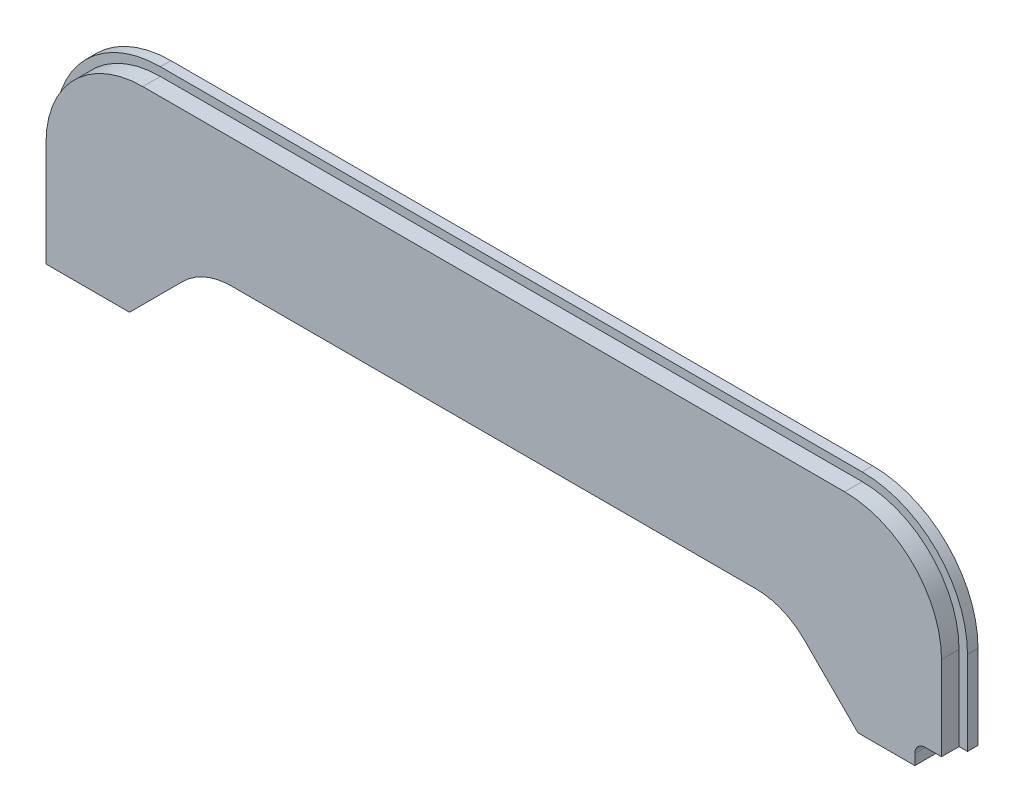
ISO-10303-21;
HEADER;
FILE_DESCRIPTION(('STEP AP214'),'2;1');
FILE_NAME('part.step','',(''),(''),'','','');
FILE_SCHEMA(('AUTOMOTIVE_DESIGN { 1 0 10303 214 1 1 1 1 }'));
ENDSEC;
DATA;
#1=APPLICATION_CONTEXT('core data for automotive mechanical design processes');
#2=APPLICATION_PROTOCOL_DEFINITION('international standard','automotive_design',2000,#1);
#3=PRODUCT_CONTEXT('',#1,'mechanical');
#4=PRODUCT('Part','Part','',(#3));
#5=PRODUCT_RELATED_PRODUCT_CATEGORY('part','',(#4));
#6=PRODUCT_DEFINITION_FORMATION('','',#4);
#7=PRODUCT_DEFINITION_CONTEXT('part definition',#1,'design');
#8=PRODUCT_DEFINITION('design','',#6,#7);
#9=PRODUCT_DEFINITION_SHAPE('','',#8);
#10=(LENGTH_UNIT() NAMED_UNIT(*) SI_UNIT(.MILLI.,.METRE.));
#11=(NAMED_UNIT(*) PLANE_ANGLE_UNIT() SI_UNIT($,.RADIAN.));
#12=(NAMED_UNIT(*) SI_UNIT($,.STERADIAN.) SOLID_ANGLE_UNIT());
#13=UNCERTAINTY_MEASURE_WITH_UNIT(LENGTH_MEASURE(1.E-05),#10,'distance_accuracy_value','');
#14=(GEOMETRIC_REPRESENTATION_CONTEXT(3) GLOBAL_UNCERTAINTY_ASSIGNED_CONTEXT((#13)) GLOBAL_UNIT_ASSIGNED_CONTEXT((#10,
#11,#12)) REPRESENTATION_CONTEXT('',''));
#15=CARTESIAN_POINT('',(0.,0.,0.));
#16=DIRECTION('',(0.,0.,1.));
#17=DIRECTION('',(1.,0.,0.));
#18=AXIS2_PLACEMENT_3D('',#15,#16,#17);
#19=CARTESIAN_POINT('',(-16.51,0.,1.016));
#20=DIRECTION('',(0.,1.,0.));
#21=DIRECTION('',(0.,0.,1.));
#22=AXIS2_PLACEMENT_3D('',#19,#20,#21);
#23=PLANE('',#22);
#24=DIRECTION('',(1.,0.,0.));
#25=VECTOR('',#24,1.);
#26=CARTESIAN_POINT('',(-16.51,0.,0.));
#27=LINE('',#26,#25);
#28=CARTESIAN_POINT('',(-16.51,0.,0.));
#29=VERTEX_POINT('',#28);
#30=CARTESIAN_POINT('',(-13.1826,0.,0.));
#31=VERTEX_POINT('',#30);
#32=EDGE_CURVE('E223',#29,#31,#27,.T.);
#33=ORIENTED_EDGE('',*,*,#32,.T.);
#34=DIRECTION('',(0.,0.,1.));
#35=VECTOR('',#34,1.);
#36=CARTESIAN_POINT('',(-13.1826,0.,0.));
#37=LINE('',#36,#35);
#38=CARTESIAN_POINT('',(-13.1826,0.,1.016));
#39=VERTEX_POINT('',#38);
#40=EDGE_CURVE('E275',#31,#39,#37,.T.);
#41=ORIENTED_EDGE('',*,*,#40,.T.);
#42=DIRECTION('',(1.,0.,0.));
#43=VECTOR('',#42,1.);
#44=CARTESIAN_POINT('',(-16.51,0.,1.016));
#45=LINE('',#44,#43);
#46=CARTESIAN_POINT('',(-16.2052,0.,1.016));
#47=VERTEX_POINT('',#46);
#48=EDGE_CURVE('E211',#47,#39,#45,.T.);
#49=ORIENTED_EDGE('',*,*,#48,.F.);
#50=DIRECTION('',(0.,0.,1.));
#51=VECTOR('',#50,1.);
#52=CARTESIAN_POINT('',(-16.2052,0.,0.381));
#53=LINE('',#52,#51);
#54=CARTESIAN_POINT('',(-16.2052,0.,0.381));
#55=VERTEX_POINT('',#54);
#56=EDGE_CURVE('E270',#55,#47,#53,.T.);
#57=ORIENTED_EDGE('',*,*,#56,.F.);
#58=DIRECTION('',(1.,0.,0.));
#59=VECTOR('',#58,1.);
#60=CARTESIAN_POINT('',(-16.51,0.,0.381));
#61=LINE('',#60,#59);
#62=CARTESIAN_POINT('',(-16.51,0.,0.381));
#63=VERTEX_POINT('',#62);
#64=EDGE_CURVE('E252',#63,#55,#61,.T.);
#65=ORIENTED_EDGE('',*,*,#64,.F.);
#66=DIRECTION('',(0.,0.,-1.));
#67=VECTOR('',#66,1.);
#68=CARTESIAN_POINT('',(-16.51,0.,1.016));
#69=LINE('',#68,#67);
#70=EDGE_CURVE('E227',#63,#29,#69,.T.);
#71=ORIENTED_EDGE('',*,*,#70,.T.);
#72=EDGE_LOOP('',(#33,#41,#49,#57,#65,#71));
#73=FACE_BOUND('',#72,.T.);
#74=ADVANCED_FACE('F40',(#73),#23,.F.);
#75=CARTESIAN_POINT('',(16.51,3.80999999999997,1.016));
#76=DIRECTION('',(-1.,0.,0.));
#77=DIRECTION('',(0.,0.,1.));
#78=AXIS2_PLACEMENT_3D('',#75,#76,#77);
#79=PLANE('',#78);
#80=DIRECTION('',(0.,1.,0.));
#81=VECTOR('',#80,1.);
#82=CARTESIAN_POINT('',(16.51,0.,0.381));
#83=LINE('',#82,#81);
#84=CARTESIAN_POINT('',(16.51,0.762,0.381));
#85=VERTEX_POINT('',#84);
#86=CARTESIAN_POINT('',(16.51,3.80999999999997,0.381));
#87=VERTEX_POINT('',#86);
#88=EDGE_CURVE('E196',#85,#87,#83,.T.);
#89=ORIENTED_EDGE('',*,*,#88,.F.);
#90=DIRECTION('',(0.,0.,1.));
#91=VECTOR('',#90,1.);
#92=CARTESIAN_POINT('',(16.51,0.762,0.));
#93=LINE('',#92,#91);
#94=CARTESIAN_POINT('',(16.51,0.762,0.));
#95=VERTEX_POINT('',#94);
#96=EDGE_CURVE('E54',#95,#85,#93,.T.);
#97=ORIENTED_EDGE('',*,*,#96,.F.);
#98=DIRECTION('',(0.,1.,0.));
#99=VECTOR('',#98,1.);
#100=CARTESIAN_POINT('',(16.51,3.80999999999997,0.));
#101=LINE('',#100,#99);
#102=CARTESIAN_POINT('',(16.51,3.80999999999997,0.));
#103=VERTEX_POINT('',#102);
#104=EDGE_CURVE('E194',#95,#103,#101,.T.);
#105=ORIENTED_EDGE('',*,*,#104,.T.);
#106=DIRECTION('',(0.,0.,-1.));
#107=VECTOR('',#106,1.);
#108=CARTESIAN_POINT('',(16.51,3.80999999999997,1.016));
#109=LINE('',#108,#107);
#110=EDGE_CURVE('E48',#87,#103,#109,.T.);
#111=ORIENTED_EDGE('',*,*,#110,.F.);
#112=EDGE_LOOP('',(#89,#97,#105,#111));
#113=FACE_BOUND('',#112,.T.);
#114=ADVANCED_FACE('F42',(#113),#79,.F.);
#115=CARTESIAN_POINT('',(12.7,3.81,1.016));
#116=DIRECTION('',(0.,0.,-1.));
#117=DIRECTION('',(-1.,0.,0.));
#118=AXIS2_PLACEMENT_3D('',#115,#116,#117);
#119=CYLINDRICAL_SURFACE('',#118,3.81);
#120=CARTESIAN_POINT('',(12.7,3.81,0.381));
#121=DIRECTION('',(0.,0.,1.));
#122=DIRECTION('',(1.,0.,0.));
#123=AXIS2_PLACEMENT_3D('',#120,#121,#122);
#124=CIRCLE('',#123,3.81);
#125=CARTESIAN_POINT('',(12.7,7.62,0.381));
#126=VERTEX_POINT('',#125);
#127=EDGE_CURVE('E238',#87,#126,#124,.T.);
#128=ORIENTED_EDGE('',*,*,#127,.F.);
#129=ORIENTED_EDGE('',*,*,#110,.T.);
#130=CARTESIAN_POINT('',(12.7,3.81,0.));
#131=DIRECTION('',(0.,0.,1.));
#132=DIRECTION('',(-1.,0.,0.));
#133=AXIS2_PLACEMENT_3D('',#130,#131,#132);
#134=CIRCLE('',#133,3.81);
#135=CARTESIAN_POINT('',(12.7,7.62,0.));
#136=VERTEX_POINT('',#135);
#137=EDGE_CURVE('E203',#103,#136,#134,.T.);
#138=ORIENTED_EDGE('',*,*,#137,.T.);
#139=DIRECTION('',(0.,0.,-1.));
#140=VECTOR('',#139,1.);
#141=CARTESIAN_POINT('',(12.7,7.62,1.016));
#142=LINE('',#141,#140);
#143=EDGE_CURVE('E233',#126,#136,#142,.T.);
#144=ORIENTED_EDGE('',*,*,#143,.F.);
#145=EDGE_LOOP('',(#128,#129,#138,#144));
#146=FACE_BOUND('',#145,.T.);
#147=ADVANCED_FACE('F236',(#146),#119,.T.);
#148=CARTESIAN_POINT('',(-12.7,7.62,1.016));
#149=DIRECTION('',(0.,-1.,0.));
#150=DIRECTION('',(0.,0.,-1.));
#151=AXIS2_PLACEMENT_3D('',#148,#149,#150);
#152=PLANE('',#151);
#153=DIRECTION('',(-1.,0.,0.));
#154=VECTOR('',#153,1.);
#155=CARTESIAN_POINT('',(12.7,7.62,0.381));
#156=LINE('',#155,#154);
#157=CARTESIAN_POINT('',(-12.7,7.62,0.381));
#158=VERTEX_POINT('',#157);
#159=EDGE_CURVE('E241',#126,#158,#156,.T.);
#160=ORIENTED_EDGE('',*,*,#159,.F.);
#161=ORIENTED_EDGE('',*,*,#143,.T.);
#162=DIRECTION('',(-1.,0.,0.));
#163=VECTOR('',#162,1.);
#164=CARTESIAN_POINT('',(-12.7,7.62,0.));
#165=LINE('',#164,#163);
#166=CARTESIAN_POINT('',(-12.7,7.62,0.));
#167=VERTEX_POINT('',#166);
#168=EDGE_CURVE('E206',#136,#167,#165,.T.);
#169=ORIENTED_EDGE('',*,*,#168,.T.);
#170=DIRECTION('',(0.,0.,-1.));
#171=VECTOR('',#170,1.);
#172=CARTESIAN_POINT('',(-12.7,7.62,1.016));
#173=LINE('',#172,#171);
#174=EDGE_CURVE('E231',#158,#167,#173,.T.);
#175=ORIENTED_EDGE('',*,*,#174,.F.);
#176=EDGE_LOOP('',(#160,#161,#169,#175));
#177=FACE_BOUND('',#176,.T.);
#178=ADVANCED_FACE('F438',(#177),#152,.F.);
#179=CARTESIAN_POINT('',(-12.7,3.81,1.016));
#180=DIRECTION('',(0.,0.,-1.));
#181=DIRECTION('',(-1.,0.,0.));
#182=AXIS2_PLACEMENT_3D('',#179,#180,#181);
#183=CYLINDRICAL_SURFACE('',#182,3.81);
#184=CARTESIAN_POINT('',(-12.7,3.81,0.381));
#185=DIRECTION('',(0.,0.,1.));
#186=DIRECTION('',(1.,0.,0.));
#187=AXIS2_PLACEMENT_3D('',#184,#185,#186);
#188=CIRCLE('',#187,3.81);
#189=CARTESIAN_POINT('',(-16.51,3.80999999999997,0.381));
#190=VERTEX_POINT('',#189);
#191=EDGE_CURVE('E243',#158,#190,#188,.T.);
#192=ORIENTED_EDGE('',*,*,#191,.F.);
#193=ORIENTED_EDGE('',*,*,#174,.T.);
#194=CARTESIAN_POINT('',(-12.7,3.81,0.));
#195=DIRECTION('',(0.,0.,1.));
#196=DIRECTION('',(1.,0.,0.));
#197=AXIS2_PLACEMENT_3D('',#194,#195,#196);
#198=CIRCLE('',#197,3.81);
#199=CARTESIAN_POINT('',(-16.51,3.80999999999997,0.));
#200=VERTEX_POINT('',#199);
#201=EDGE_CURVE('E216',#167,#200,#198,.T.);
#202=ORIENTED_EDGE('',*,*,#201,.T.);
#203=DIRECTION('',(0.,0.,-1.));
#204=VECTOR('',#203,1.);
#205=CARTESIAN_POINT('',(-16.51,3.80999999999997,1.016));
#206=LINE('',#205,#204);
#207=EDGE_CURVE('E229',#190,#200,#206,.T.);
#208=ORIENTED_EDGE('',*,*,#207,.F.);
#209=EDGE_LOOP('',(#192,#193,#202,#208));
#210=FACE_BOUND('',#209,.T.);
#211=ADVANCED_FACE('F434',(#210),#183,.T.);
#212=CARTESIAN_POINT('',(-16.51,3.80999999999997,1.016));
#213=DIRECTION('',(1.,0.,0.));
#214=DIRECTION('',(0.,0.,-1.));
#215=AXIS2_PLACEMENT_3D('',#212,#213,#214);
#216=PLANE('',#215);
#217=DIRECTION('',(0.,-1.,0.));
#218=VECTOR('',#217,1.);
#219=CARTESIAN_POINT('',(-16.51,3.80999999999997,0.381));
#220=LINE('',#219,#218);
#221=EDGE_CURVE('E250',#190,#63,#220,.T.);
#222=ORIENTED_EDGE('',*,*,#221,.F.);
#223=ORIENTED_EDGE('',*,*,#207,.T.);
#224=DIRECTION('',(0.,-1.,0.));
#225=VECTOR('',#224,1.);
#226=CARTESIAN_POINT('',(-16.51,3.80999999999997,0.));
#227=LINE('',#226,#225);
#228=EDGE_CURVE('E219',#200,#29,#227,.T.);
#229=ORIENTED_EDGE('',*,*,#228,.T.);
#230=ORIENTED_EDGE('',*,*,#70,.F.);
#231=EDGE_LOOP('',(#222,#223,#229,#230));
#232=FACE_BOUND('',#231,.T.);
#233=ADVANCED_FACE('F396',(#232),#216,.F.);
#234=CARTESIAN_POINT('',(13.1826,0.,0.));
#235=VERTEX_POINT('',#234);
#236=CARTESIAN_POINT('',(15.24,0.,0.));
#237=VERTEX_POINT('',#236);
#238=EDGE_CURVE('E222',#235,#237,#27,.T.);
#239=ORIENTED_EDGE('',*,*,#238,.T.);
#240=DIRECTION('',(0.,0.,1.));
#241=VECTOR('',#240,1.);
#242=CARTESIAN_POINT('',(15.24,0.,0.));
#243=LINE('',#242,#241);
#244=CARTESIAN_POINT('',(15.24,0.,1.016));
#245=VERTEX_POINT('',#244);
#246=EDGE_CURVE('E319',#237,#245,#243,.T.);
#247=ORIENTED_EDGE('',*,*,#246,.T.);
#248=CARTESIAN_POINT('',(13.1826,0.,1.016));
#249=VERTEX_POINT('',#248);
#250=EDGE_CURVE('E226',#249,#245,#45,.T.);
#251=ORIENTED_EDGE('',*,*,#250,.F.);
#252=DIRECTION('',(0.,0.,1.));
#253=VECTOR('',#252,1.);
#254=CARTESIAN_POINT('',(13.1826,0.,0.));
#255=LINE('',#254,#253);
#256=EDGE_CURVE('E317',#235,#249,#255,.T.);
#257=ORIENTED_EDGE('',*,*,#256,.F.);
#258=EDGE_LOOP('',(#239,#247,#251,#257));
#259=FACE_BOUND('',#258,.T.);
#260=ADVANCED_FACE('F316',(#259),#23,.F.);
#261=CARTESIAN_POINT('',(-12.7,3.81,1.016));
#262=DIRECTION('',(0.,0.,1.));
#263=DIRECTION('',(1.,0.,0.));
#264=AXIS2_PLACEMENT_3D('',#261,#262,#263);
#265=PLANE('',#264);
#266=DIRECTION('',(0.,-1.,0.));
#267=VECTOR('',#266,1.);
#268=CARTESIAN_POINT('',(15.24,0.,1.016));
#269=LINE('',#268,#267);
#270=CARTESIAN_POINT('',(15.24,0.381,1.016));
#271=VERTEX_POINT('',#270);
#272=EDGE_CURVE('E189',#271,#245,#269,.T.);
#273=ORIENTED_EDGE('',*,*,#272,.F.);
#274=CARTESIAN_POINT('',(15.621,0.381,1.016));
#275=DIRECTION('',(0.,0.,1.));
#276=DIRECTION('',(1.,0.,0.));
#277=AXIS2_PLACEMENT_3D('',#274,#275,#276);
#278=CIRCLE('',#277,0.381);
#279=CARTESIAN_POINT('',(15.621,0.762,1.016));
#280=VERTEX_POINT('',#279);
#281=EDGE_CURVE('E372',#280,#271,#278,.T.);
#282=ORIENTED_EDGE('',*,*,#281,.F.);
#283=DIRECTION('',(-1.,0.,0.));
#284=VECTOR('',#283,1.);
#285=CARTESIAN_POINT('',(16.51,0.762,1.016));
#286=LINE('',#285,#284);
#287=CARTESIAN_POINT('',(16.2052,0.762,1.016));
#288=VERTEX_POINT('',#287);
#289=EDGE_CURVE('E371',#288,#280,#286,.T.);
#290=ORIENTED_EDGE('',*,*,#289,.F.);
#291=DIRECTION('',(0.,-1.,0.));
#292=VECTOR('',#291,1.);
#293=CARTESIAN_POINT('',(16.2052,0.,1.016));
#294=LINE('',#293,#292);
#295=CARTESIAN_POINT('',(16.2052,3.80999999999997,1.016));
#296=VERTEX_POINT('',#295);
#297=EDGE_CURVE('E245',#296,#288,#294,.T.);
#298=ORIENTED_EDGE('',*,*,#297,.F.);
#299=CARTESIAN_POINT('',(12.7,3.81,1.016));
#300=DIRECTION('',(0.,0.,-1.));
#301=DIRECTION('',(1.,0.,0.));
#302=AXIS2_PLACEMENT_3D('',#299,#300,#301);
#303=CIRCLE('',#302,3.5052);
#304=CARTESIAN_POINT('',(12.7,7.3152,1.016));
#305=VERTEX_POINT('',#304);
#306=EDGE_CURVE('E281',#305,#296,#303,.T.);
#307=ORIENTED_EDGE('',*,*,#306,.F.);
#308=DIRECTION('',(1.,0.,0.));
#309=VECTOR('',#308,1.);
#310=CARTESIAN_POINT('',(12.7,7.3152,1.016));
#311=LINE('',#310,#309);
#312=CARTESIAN_POINT('',(-12.7,7.3152,1.016));
#313=VERTEX_POINT('',#312);
#314=EDGE_CURVE('E278',#313,#305,#311,.T.);
#315=ORIENTED_EDGE('',*,*,#314,.F.);
#316=CARTESIAN_POINT('',(-12.7,3.81,1.016));
#317=DIRECTION('',(0.,0.,-1.));
#318=DIRECTION('',(1.,0.,0.));
#319=AXIS2_PLACEMENT_3D('',#316,#317,#318);
#320=CIRCLE('',#319,3.5052);
#321=CARTESIAN_POINT('',(-16.2052,3.80999999999998,1.016));
#322=VERTEX_POINT('',#321);
#323=EDGE_CURVE('E274',#322,#313,#320,.T.);
#324=ORIENTED_EDGE('',*,*,#323,.F.);
#325=DIRECTION('',(0.,1.,0.));
#326=VECTOR('',#325,1.);
#327=CARTESIAN_POINT('',(-16.2052,3.80999999999997,1.016));
#328=LINE('',#327,#326);
#329=EDGE_CURVE('E271',#47,#322,#328,.T.);
#330=ORIENTED_EDGE('',*,*,#329,.F.);
#331=ORIENTED_EDGE('',*,*,#48,.T.);
#332=DIRECTION('',(-0.707106781186545,-0.70710678118655,0.));
#333=VECTOR('',#332,1.);
#334=CARTESIAN_POINT('',(-13.1826,0.,1.016));
#335=LINE('',#334,#333);
#336=CARTESIAN_POINT('',(-11.2446698002705,1.93793019972955,1.016));
#337=VERTEX_POINT('',#336);
#338=EDGE_CURVE('E336',#337,#39,#335,.T.);
#339=ORIENTED_EDGE('',*,*,#338,.F.);
#340=CARTESIAN_POINT('',(-9.48453960054091,0.1778,1.016));
#341=DIRECTION('',(0.,0.,1.));
#342=DIRECTION('',(1.,0.,0.));
#343=AXIS2_PLACEMENT_3D('',#340,#341,#342);
#344=CIRCLE('',#343,2.4892);
#345=CARTESIAN_POINT('',(-9.48453960054091,2.667,1.016));
#346=VERTEX_POINT('',#345);
#347=EDGE_CURVE('E354',#346,#337,#344,.T.);
#348=ORIENTED_EDGE('',*,*,#347,.F.);
#349=DIRECTION('',(-1.,0.,0.));
#350=VECTOR('',#349,1.);
#351=CARTESIAN_POINT('',(-9.48453960054091,2.667,1.016));
#352=LINE('',#351,#350);
#353=CARTESIAN_POINT('',(9.48453960054091,2.667,1.016));
#354=VERTEX_POINT('',#353);
#355=EDGE_CURVE('E351',#354,#346,#352,.T.);
#356=ORIENTED_EDGE('',*,*,#355,.F.);
#357=CARTESIAN_POINT('',(9.48453960054091,0.1778,1.016));
#358=DIRECTION('',(0.,0.,1.));
#359=DIRECTION('',(-1.,0.,0.));
#360=AXIS2_PLACEMENT_3D('',#357,#358,#359);
#361=CIRCLE('',#360,2.4892);
#362=CARTESIAN_POINT('',(11.2446698002705,1.93793019972955,1.016));
#363=VERTEX_POINT('',#362);
#364=EDGE_CURVE('E348',#363,#354,#361,.T.);
#365=ORIENTED_EDGE('',*,*,#364,.F.);
#366=DIRECTION('',(-0.707106781186546,0.707106781186549,0.));
#367=VECTOR('',#366,1.);
#368=CARTESIAN_POINT('',(13.1826,0.,1.016));
#369=LINE('',#368,#367);
#370=EDGE_CURVE('E311',#249,#363,#369,.T.);
#371=ORIENTED_EDGE('',*,*,#370,.F.);
#372=ORIENTED_EDGE('',*,*,#250,.T.);
#373=EDGE_LOOP('',(#273,#282,#290,#298,#307,#315,#324,#330,#331,#339,#348,#356,#365,#371,#372));
#374=FACE_BOUND('',#373,.T.);
#375=ADVANCED_FACE('F301',(#374),#265,.T.);
#376=CARTESIAN_POINT('',(-12.7,3.81,0.));
#377=DIRECTION('',(0.,0.,1.));
#378=DIRECTION('',(1.,0.,0.));
#379=AXIS2_PLACEMENT_3D('',#376,#377,#378);
#380=PLANE('',#379);
#381=CARTESIAN_POINT('',(15.621,0.381,0.));
#382=DIRECTION('',(0.,0.,1.));
#383=DIRECTION('',(1.,0.,0.));
#384=AXIS2_PLACEMENT_3D('',#381,#382,#383);
#385=CIRCLE('',#384,0.381);
#386=CARTESIAN_POINT('',(15.621,0.762,0.));
#387=VERTEX_POINT('',#386);
#388=CARTESIAN_POINT('',(15.24,0.381,0.));
#389=VERTEX_POINT('',#388);
#390=EDGE_CURVE('E188',#387,#389,#385,.T.);
#391=ORIENTED_EDGE('',*,*,#390,.T.);
#392=DIRECTION('',(0.,-1.,0.));
#393=VECTOR('',#392,1.);
#394=CARTESIAN_POINT('',(15.24,0.,0.));
#395=LINE('',#394,#393);
#396=EDGE_CURVE('E197',#389,#237,#395,.T.);
#397=ORIENTED_EDGE('',*,*,#396,.T.);
#398=ORIENTED_EDGE('',*,*,#238,.F.);
#399=DIRECTION('',(-0.707106781186546,0.707106781186549,0.));
#400=VECTOR('',#399,1.);
#401=CARTESIAN_POINT('',(13.1826,0.,0.));
#402=LINE('',#401,#400);
#403=CARTESIAN_POINT('',(11.2446698002705,1.93793019972955,0.));
#404=VERTEX_POINT('',#403);
#405=EDGE_CURVE('E333',#235,#404,#402,.T.);
#406=ORIENTED_EDGE('',*,*,#405,.T.);
#407=CARTESIAN_POINT('',(9.48453960054091,0.1778,0.));
#408=DIRECTION('',(0.,0.,1.));
#409=DIRECTION('',(-1.,0.,0.));
#410=AXIS2_PLACEMENT_3D('',#407,#408,#409);
#411=CIRCLE('',#410,2.4892);
#412=CARTESIAN_POINT('',(9.48453960054091,2.667,0.));
#413=VERTEX_POINT('',#412);
#414=EDGE_CURVE('E62',#404,#413,#411,.T.);
#415=ORIENTED_EDGE('',*,*,#414,.T.);
#416=DIRECTION('',(-1.,0.,0.));
#417=VECTOR('',#416,1.);
#418=CARTESIAN_POINT('',(-9.48453960054091,2.667,0.));
#419=LINE('',#418,#417);
#420=CARTESIAN_POINT('',(-9.48453960054091,2.667,0.));
#421=VERTEX_POINT('',#420);
#422=EDGE_CURVE('E338',#413,#421,#419,.T.);
#423=ORIENTED_EDGE('',*,*,#422,.T.);
#424=CARTESIAN_POINT('',(-9.48453960054091,0.1778,0.));
#425=DIRECTION('',(0.,0.,1.));
#426=DIRECTION('',(1.,0.,0.));
#427=AXIS2_PLACEMENT_3D('',#424,#425,#426);
#428=CIRCLE('',#427,2.4892);
#429=CARTESIAN_POINT('',(-11.2446698002705,1.93793019972955,0.));
#430=VERTEX_POINT('',#429);
#431=EDGE_CURVE('E341',#421,#430,#428,.T.);
#432=ORIENTED_EDGE('',*,*,#431,.T.);
#433=DIRECTION('',(-0.707106781186545,-0.70710678118655,0.));
#434=VECTOR('',#433,1.);
#435=CARTESIAN_POINT('',(-13.1826,0.,0.));
#436=LINE('',#435,#434);
#437=EDGE_CURVE('E344',#430,#31,#436,.T.);
#438=ORIENTED_EDGE('',*,*,#437,.T.);
#439=ORIENTED_EDGE('',*,*,#32,.F.);
#440=ORIENTED_EDGE('',*,*,#228,.F.);
#441=ORIENTED_EDGE('',*,*,#201,.F.);
#442=ORIENTED_EDGE('',*,*,#168,.F.);
#443=ORIENTED_EDGE('',*,*,#137,.F.);
#444=ORIENTED_EDGE('',*,*,#104,.F.);
#445=DIRECTION('',(-1.,0.,0.));
#446=VECTOR('',#445,1.);
#447=CARTESIAN_POINT('',(16.51,0.762,0.));
#448=LINE('',#447,#446);
#449=EDGE_CURVE('E180',#95,#387,#448,.T.);
#450=ORIENTED_EDGE('',*,*,#449,.T.);
#451=EDGE_LOOP('',(#391,#397,#398,#406,#415,#423,#432,#438,#439,#440,#441,#442,#443,#444,#450));
#452=FACE_BOUND('',#451,.T.);
#453=ADVANCED_FACE('F200',(#452),#380,.F.);
#454=CARTESIAN_POINT('',(16.2052,0.,0.381));
#455=DIRECTION('',(-1.,0.,0.));
#456=DIRECTION('',(0.,0.,1.));
#457=AXIS2_PLACEMENT_3D('',#454,#455,#456);
#458=PLANE('',#457);
#459=ORIENTED_EDGE('',*,*,#297,.T.);
#460=DIRECTION('',(0.,0.,-1.));
#461=VECTOR('',#460,1.);
#462=CARTESIAN_POINT('',(16.2052,0.762,0.381));
#463=LINE('',#462,#461);
#464=CARTESIAN_POINT('',(16.2052,0.762,0.381));
#465=VERTEX_POINT('',#464);
#466=EDGE_CURVE('E323',#288,#465,#463,.T.);
#467=ORIENTED_EDGE('',*,*,#466,.T.);
#468=DIRECTION('',(0.,-1.,0.));
#469=VECTOR('',#468,1.);
#470=CARTESIAN_POINT('',(16.2052,0.,0.381));
#471=LINE('',#470,#469);
#472=CARTESIAN_POINT('',(16.2052,3.80999999999997,0.381));
#473=VERTEX_POINT('',#472);
#474=EDGE_CURVE('E267',#473,#465,#471,.T.);
#475=ORIENTED_EDGE('',*,*,#474,.F.);
#476=DIRECTION('',(0.,0.,1.));
#477=VECTOR('',#476,1.);
#478=CARTESIAN_POINT('',(16.2052,3.80999999999997,0.381));
#479=LINE('',#478,#477);
#480=EDGE_CURVE('E204',#473,#296,#479,.T.);
#481=ORIENTED_EDGE('',*,*,#480,.T.);
#482=EDGE_LOOP('',(#459,#467,#475,#481));
#483=FACE_BOUND('',#482,.T.);
#484=ADVANCED_FACE('F381',(#483),#458,.F.);
#485=CARTESIAN_POINT('',(12.7,3.81,0.381));
#486=DIRECTION('',(0.,0.,1.));
#487=DIRECTION('',(1.,0.,0.));
#488=AXIS2_PLACEMENT_3D('',#485,#486,#487);
#489=CYLINDRICAL_SURFACE('',#488,3.5052);
#490=ORIENTED_EDGE('',*,*,#306,.T.);
#491=ORIENTED_EDGE('',*,*,#480,.F.);
#492=CARTESIAN_POINT('',(12.7,3.81,0.381));
#493=DIRECTION('',(0.,0.,-1.));
#494=DIRECTION('',(1.,0.,0.));
#495=AXIS2_PLACEMENT_3D('',#492,#493,#494);
#496=CIRCLE('',#495,3.5052);
#497=CARTESIAN_POINT('',(12.7,7.3152,0.381));
#498=VERTEX_POINT('',#497);
#499=EDGE_CURVE('E264',#498,#473,#496,.T.);
#500=ORIENTED_EDGE('',*,*,#499,.F.);
#501=DIRECTION('',(0.,0.,1.));
#502=VECTOR('',#501,1.);
#503=CARTESIAN_POINT('',(12.7,7.3152,0.381));
#504=LINE('',#503,#502);
#505=EDGE_CURVE('E208',#498,#305,#504,.T.);
#506=ORIENTED_EDGE('',*,*,#505,.T.);
#507=EDGE_LOOP('',(#490,#491,#500,#506));
#508=FACE_BOUND('',#507,.T.);
#509=ADVANCED_FACE('F385',(#508),#489,.T.);
#510=CARTESIAN_POINT('',(12.7,7.3152,0.381));
#511=DIRECTION('',(0.,-1.,0.));
#512=DIRECTION('',(1.,0.,0.));
#513=AXIS2_PLACEMENT_3D('',#510,#511,#512);
#514=PLANE('',#513);
#515=ORIENTED_EDGE('',*,*,#314,.T.);
#516=ORIENTED_EDGE('',*,*,#505,.F.);
#517=DIRECTION('',(1.,0.,0.));
#518=VECTOR('',#517,1.);
#519=CARTESIAN_POINT('',(12.7,7.3152,0.381));
#520=LINE('',#519,#518);
#521=CARTESIAN_POINT('',(-12.7,7.3152,0.381));
#522=VERTEX_POINT('',#521);
#523=EDGE_CURVE('E261',#522,#498,#520,.T.);
#524=ORIENTED_EDGE('',*,*,#523,.F.);
#525=DIRECTION('',(0.,0.,1.));
#526=VECTOR('',#525,1.);
#527=CARTESIAN_POINT('',(-12.7,7.3152,0.381));
#528=LINE('',#527,#526);
#529=EDGE_CURVE('E287',#522,#313,#528,.T.);
#530=ORIENTED_EDGE('',*,*,#529,.T.);
#531=EDGE_LOOP('',(#515,#516,#524,#530));
#532=FACE_BOUND('',#531,.T.);
#533=ADVANCED_FACE('F387',(#532),#514,.F.);
#534=CARTESIAN_POINT('',(-12.7,3.81,0.381));
#535=DIRECTION('',(0.,0.,1.));
#536=DIRECTION('',(1.,0.,0.));
#537=AXIS2_PLACEMENT_3D('',#534,#535,#536);
#538=CYLINDRICAL_SURFACE('',#537,3.5052);
#539=ORIENTED_EDGE('',*,*,#323,.T.);
#540=ORIENTED_EDGE('',*,*,#529,.F.);
#541=CARTESIAN_POINT('',(-12.7,3.81,0.381));
#542=DIRECTION('',(0.,0.,-1.));
#543=DIRECTION('',(1.,0.,0.));
#544=AXIS2_PLACEMENT_3D('',#541,#542,#543);
#545=CIRCLE('',#544,3.5052);
#546=CARTESIAN_POINT('',(-16.2052,3.80999999999998,0.381));
#547=VERTEX_POINT('',#546);
#548=EDGE_CURVE('E258',#547,#522,#545,.T.);
#549=ORIENTED_EDGE('',*,*,#548,.F.);
#550=DIRECTION('',(0.,0.,1.));
#551=VECTOR('',#550,1.);
#552=CARTESIAN_POINT('',(-16.2052,3.80999999999998,0.381));
#553=LINE('',#552,#551);
#554=EDGE_CURVE('E289',#547,#322,#553,.T.);
#555=ORIENTED_EDGE('',*,*,#554,.T.);
#556=EDGE_LOOP('',(#539,#540,#549,#555));
#557=FACE_BOUND('',#556,.T.);
#558=ADVANCED_FACE('F391',(#557),#538,.T.);
#559=CARTESIAN_POINT('',(-16.2052,3.80999999999997,0.381));
#560=DIRECTION('',(1.,0.,0.));
#561=DIRECTION('',(0.,0.,-1.));
#562=AXIS2_PLACEMENT_3D('',#559,#560,#561);
#563=PLANE('',#562);
#564=ORIENTED_EDGE('',*,*,#329,.T.);
#565=ORIENTED_EDGE('',*,*,#554,.F.);
#566=DIRECTION('',(0.,1.,0.));
#567=VECTOR('',#566,1.);
#568=CARTESIAN_POINT('',(-16.2052,3.80999999999997,0.381));
#569=LINE('',#568,#567);
#570=EDGE_CURVE('E255',#55,#547,#569,.T.);
#571=ORIENTED_EDGE('',*,*,#570,.F.);
#572=ORIENTED_EDGE('',*,*,#56,.T.);
#573=EDGE_LOOP('',(#564,#565,#571,#572));
#574=FACE_BOUND('',#573,.T.);
#575=ADVANCED_FACE('F293',(#574),#563,.F.);
#576=CARTESIAN_POINT('',(12.7,3.81,0.381));
#577=DIRECTION('',(0.,0.,1.));
#578=DIRECTION('',(1.,0.,0.));
#579=AXIS2_PLACEMENT_3D('',#576,#577,#578);
#580=PLANE('',#579);
#581=DIRECTION('',(-1.,0.,0.));
#582=VECTOR('',#581,1.);
#583=CARTESIAN_POINT('',(12.7,0.762,0.381));
#584=LINE('',#583,#582);
#585=EDGE_CURVE('E11',#85,#465,#584,.T.);
#586=ORIENTED_EDGE('',*,*,#585,.F.);
#587=ORIENTED_EDGE('',*,*,#88,.T.);
#588=ORIENTED_EDGE('',*,*,#127,.T.);
#589=ORIENTED_EDGE('',*,*,#159,.T.);
#590=ORIENTED_EDGE('',*,*,#191,.T.);
#591=ORIENTED_EDGE('',*,*,#221,.T.);
#592=ORIENTED_EDGE('',*,*,#64,.T.);
#593=ORIENTED_EDGE('',*,*,#570,.T.);
#594=ORIENTED_EDGE('',*,*,#548,.T.);
#595=ORIENTED_EDGE('',*,*,#523,.T.);
#596=ORIENTED_EDGE('',*,*,#499,.T.);
#597=ORIENTED_EDGE('',*,*,#474,.T.);
#598=EDGE_LOOP('',(#586,#587,#588,#589,#590,#591,#592,#593,#594,#595,#596,#597));
#599=FACE_BOUND('',#598,.T.);
#600=ADVANCED_FACE('F392',(#599),#580,.T.);
#601=CARTESIAN_POINT('',(-13.1826,0.,0.));
#602=DIRECTION('',(-0.70710678118655,0.707106781186545,0.));
#603=DIRECTION('',(-0.707106781186545,-0.70710678118655,0.));
#604=AXIS2_PLACEMENT_3D('',#601,#602,#603);
#605=PLANE('',#604);
#606=ORIENTED_EDGE('',*,*,#338,.T.);
#607=ORIENTED_EDGE('',*,*,#40,.F.);
#608=ORIENTED_EDGE('',*,*,#437,.F.);
#609=DIRECTION('',(0.,0.,1.));
#610=VECTOR('',#609,1.);
#611=CARTESIAN_POINT('',(-11.2446698002705,1.93793019972955,0.));
#612=LINE('',#611,#610);
#613=EDGE_CURVE('E359',#430,#337,#612,.T.);
#614=ORIENTED_EDGE('',*,*,#613,.T.);
#615=EDGE_LOOP('',(#606,#607,#608,#614));
#616=FACE_BOUND('',#615,.T.);
#617=ADVANCED_FACE('F404',(#616),#605,.F.);
#618=CARTESIAN_POINT('',(-9.48453960054091,0.1778,0.));
#619=DIRECTION('',(0.,0.,1.));
#620=DIRECTION('',(1.,0.,0.));
#621=AXIS2_PLACEMENT_3D('',#618,#619,#620);
#622=CYLINDRICAL_SURFACE('',#621,2.4892);
#623=ORIENTED_EDGE('',*,*,#347,.T.);
#624=ORIENTED_EDGE('',*,*,#613,.F.);
#625=ORIENTED_EDGE('',*,*,#431,.F.);
#626=DIRECTION('',(0.,0.,1.));
#627=VECTOR('',#626,1.);
#628=CARTESIAN_POINT('',(-9.48453960054091,2.667,0.));
#629=LINE('',#628,#627);
#630=EDGE_CURVE('E361',#421,#346,#629,.T.);
#631=ORIENTED_EDGE('',*,*,#630,.T.);
#632=EDGE_LOOP('',(#623,#624,#625,#631));
#633=FACE_BOUND('',#632,.T.);
#634=ADVANCED_FACE('F408',(#633),#622,.F.);
#635=CARTESIAN_POINT('',(-9.48453960054091,2.667,0.));
#636=DIRECTION('',(0.,1.,0.));
#637=DIRECTION('',(-1.,0.,0.));
#638=AXIS2_PLACEMENT_3D('',#635,#636,#637);
#639=PLANE('',#638);
#640=ORIENTED_EDGE('',*,*,#355,.T.);
#641=ORIENTED_EDGE('',*,*,#630,.F.);
#642=ORIENTED_EDGE('',*,*,#422,.F.);
#643=DIRECTION('',(0.,0.,1.));
#644=VECTOR('',#643,1.);
#645=CARTESIAN_POINT('',(9.48453960054091,2.667,0.));
#646=LINE('',#645,#644);
#647=EDGE_CURVE('E363',#413,#354,#646,.T.);
#648=ORIENTED_EDGE('',*,*,#647,.T.);
#649=EDGE_LOOP('',(#640,#641,#642,#648));
#650=FACE_BOUND('',#649,.T.);
#651=ADVANCED_FACE('F411',(#650),#639,.F.);
#652=CARTESIAN_POINT('',(9.48453960054091,0.1778,0.));
#653=DIRECTION('',(0.,0.,1.));
#654=DIRECTION('',(1.,0.,0.));
#655=AXIS2_PLACEMENT_3D('',#652,#653,#654);
#656=CYLINDRICAL_SURFACE('',#655,2.4892);
#657=ORIENTED_EDGE('',*,*,#364,.T.);
#658=ORIENTED_EDGE('',*,*,#647,.F.);
#659=ORIENTED_EDGE('',*,*,#414,.F.);
#660=DIRECTION('',(0.,0.,1.));
#661=VECTOR('',#660,1.);
#662=CARTESIAN_POINT('',(11.2446698002705,1.93793019972955,0.));
#663=LINE('',#662,#661);
#664=EDGE_CURVE('E365',#404,#363,#663,.T.);
#665=ORIENTED_EDGE('',*,*,#664,.T.);
#666=EDGE_LOOP('',(#657,#658,#659,#665));
#667=FACE_BOUND('',#666,.T.);
#668=ADVANCED_FACE('F412',(#667),#656,.F.);
#669=CARTESIAN_POINT('',(13.1826,0.,0.));
#670=DIRECTION('',(0.707106781186549,0.707106781186546,0.));
#671=DIRECTION('',(-0.707106781186546,0.707106781186549,0.));
#672=AXIS2_PLACEMENT_3D('',#669,#670,#671);
#673=PLANE('',#672);
#674=ORIENTED_EDGE('',*,*,#370,.T.);
#675=ORIENTED_EDGE('',*,*,#664,.F.);
#676=ORIENTED_EDGE('',*,*,#405,.F.);
#677=ORIENTED_EDGE('',*,*,#256,.T.);
#678=EDGE_LOOP('',(#674,#675,#676,#677));
#679=FACE_BOUND('',#678,.T.);
#680=ADVANCED_FACE('F367',(#679),#673,.F.);
#681=CARTESIAN_POINT('',(16.51,0.762,0.));
#682=DIRECTION('',(0.,1.,0.));
#683=DIRECTION('',(-1.,0.,0.));
#684=AXIS2_PLACEMENT_3D('',#681,#682,#683);
#685=PLANE('',#684);
#686=ORIENTED_EDGE('',*,*,#289,.T.);
#687=DIRECTION('',(0.,0.,1.));
#688=VECTOR('',#687,1.);
#689=CARTESIAN_POINT('',(15.621,0.762,0.));
#690=LINE('',#689,#688);
#691=EDGE_CURVE('E183',#387,#280,#690,.T.);
#692=ORIENTED_EDGE('',*,*,#691,.F.);
#693=ORIENTED_EDGE('',*,*,#449,.F.);
#694=ORIENTED_EDGE('',*,*,#96,.T.);
#695=ORIENTED_EDGE('',*,*,#585,.T.);
#696=ORIENTED_EDGE('',*,*,#466,.F.);
#697=EDGE_LOOP('',(#686,#692,#693,#694,#695,#696));
#698=FACE_BOUND('',#697,.T.);
#699=ADVANCED_FACE('F181',(#698),#685,.F.);
#700=CARTESIAN_POINT('',(15.24,0.,0.));
#701=DIRECTION('',(-1.,0.,0.));
#702=DIRECTION('',(0.,0.,1.));
#703=AXIS2_PLACEMENT_3D('',#700,#701,#702);
#704=PLANE('',#703);
#705=ORIENTED_EDGE('',*,*,#272,.T.);
#706=ORIENTED_EDGE('',*,*,#246,.F.);
#707=ORIENTED_EDGE('',*,*,#396,.F.);
#708=DIRECTION('',(0.,0.,1.));
#709=VECTOR('',#708,1.);
#710=CARTESIAN_POINT('',(15.24,0.381,0.));
#711=LINE('',#710,#709);
#712=EDGE_CURVE('E324',#389,#271,#711,.T.);
#713=ORIENTED_EDGE('',*,*,#712,.T.);
#714=EDGE_LOOP('',(#705,#706,#707,#713));
#715=FACE_BOUND('',#714,.T.);
#716=ADVANCED_FACE('F375',(#715),#704,.F.);
#717=CARTESIAN_POINT('',(15.621,0.381,0.));
#718=DIRECTION('',(0.,0.,1.));
#719=DIRECTION('',(1.,0.,0.));
#720=AXIS2_PLACEMENT_3D('',#717,#718,#719);
#721=CYLINDRICAL_SURFACE('',#720,0.381);
#722=ORIENTED_EDGE('',*,*,#281,.T.);
#723=ORIENTED_EDGE('',*,*,#712,.F.);
#724=ORIENTED_EDGE('',*,*,#390,.F.);
#725=ORIENTED_EDGE('',*,*,#691,.T.);
#726=EDGE_LOOP('',(#722,#723,#724,#725));
#727=FACE_BOUND('',#726,.T.);
#728=ADVANCED_FACE('F376',(#727),#721,.F.);
#729=CLOSED_SHELL('',(#74,#114,#147,#178,#211,#233,#260,#375,#453,#484,#509,#533,#558,#575,#600,
#617,#634,#651,#668,#680,#699,#716,#728));
#730=MANIFOLD_SOLID_BREP('B2',#729);
#731=ADVANCED_BREP_SHAPE_REPRESENTATION('',(#18,#730),#14);
#732=SHAPE_DEFINITION_REPRESENTATION(#9,#731);
ENDSEC;
END-ISO-10303-21;
